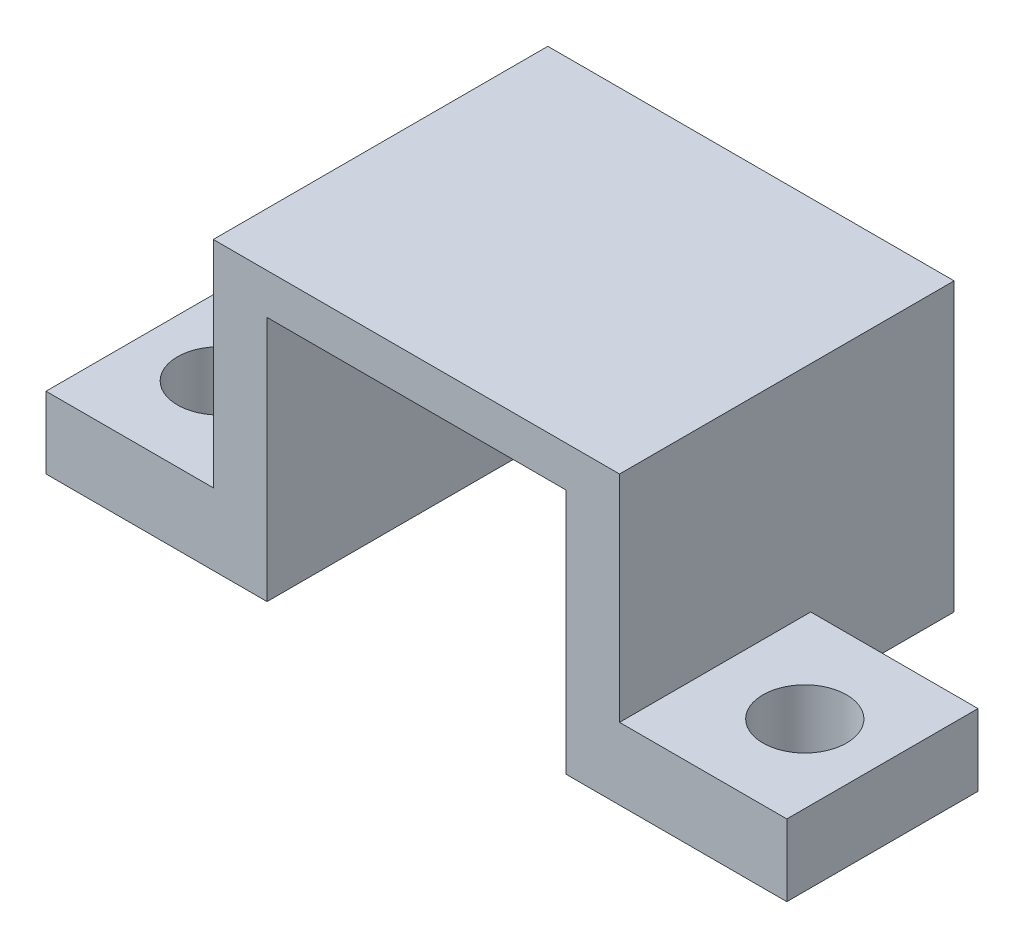
ISO-10303-21;
HEADER;
FILE_DESCRIPTION(('STEP AP214'),'2;1');
FILE_NAME('part.step','',(''),(''),'','','');
FILE_SCHEMA(('AUTOMOTIVE_DESIGN { 1 0 10303 214 1 1 1 1 }'));
ENDSEC;
DATA;
#1=APPLICATION_CONTEXT('core data for automotive mechanical design processes');
#2=APPLICATION_PROTOCOL_DEFINITION('international standard','automotive_design',2000,#1);
#3=PRODUCT_CONTEXT('',#1,'mechanical');
#4=PRODUCT('Part','Part','',(#3));
#5=PRODUCT_RELATED_PRODUCT_CATEGORY('part','',(#4));
#6=PRODUCT_DEFINITION_FORMATION('','',#4);
#7=PRODUCT_DEFINITION_CONTEXT('part definition',#1,'design');
#8=PRODUCT_DEFINITION('design','',#6,#7);
#9=PRODUCT_DEFINITION_SHAPE('','',#8);
#10=(LENGTH_UNIT() NAMED_UNIT(*) SI_UNIT(.MILLI.,.METRE.));
#11=(NAMED_UNIT(*) PLANE_ANGLE_UNIT() SI_UNIT($,.RADIAN.));
#12=(NAMED_UNIT(*) SI_UNIT($,.STERADIAN.) SOLID_ANGLE_UNIT());
#13=UNCERTAINTY_MEASURE_WITH_UNIT(LENGTH_MEASURE(1.E-05),#10,'distance_accuracy_value','');
#14=(GEOMETRIC_REPRESENTATION_CONTEXT(3) GLOBAL_UNCERTAINTY_ASSIGNED_CONTEXT((#13)) GLOBAL_UNIT_ASSIGNED_CONTEXT((#10,
#11,#12)) REPRESENTATION_CONTEXT('',''));
#15=CARTESIAN_POINT('',(0.,0.,0.));
#16=DIRECTION('',(0.,0.,1.));
#17=DIRECTION('',(1.,0.,0.));
#18=AXIS2_PLACEMENT_3D('',#15,#16,#17);
#19=CARTESIAN_POINT('',(0.,5.00000041370185E-05,0.));
#20=DIRECTION('',(0.,-1.,0.));
#21=DIRECTION('',(0.,0.,-1.));
#22=AXIS2_PLACEMENT_3D('',#19,#20,#21);
#23=PLANE('',#22);
#24=CARTESIAN_POINT('',(3.25002521276474,5.00000041370185E-05,10.0000251680613));
#25=DIRECTION('',(0.,-1.,0.));
#26=DIRECTION('',(0.,0.,-1.));
#27=AXIS2_PLACEMENT_3D('',#24,#25,#26);
#28=CIRCLE('',#27,1.75);
#29=CARTESIAN_POINT('',(3.25002521276474,5.00000041370185E-05,8.25002516806126));
#30=VERTEX_POINT('',#29);
#31=EDGE_CURVE('E170',#30,#30,#28,.T.);
#32=ORIENTED_EDGE('',*,*,#31,.F.);
#33=EDGE_LOOP('',(#32));
#34=FACE_BOUND('',#33,.T.);
#35=DIRECTION('',(0.,0.,1.));
#36=VECTOR('',#35,1.);
#37=CARTESIAN_POINT('',(9.25002433359623,5.00000041370185E-05,2.46800482273102E-05));
#38=LINE('',#37,#36);
#39=CARTESIAN_POINT('',(9.25002433359623,5.00000041370185E-05,2.46800482273102E-05));
#40=VERTEX_POINT('',#39);
#41=CARTESIAN_POINT('',(9.25002433359623,5.00000041370185E-05,14.0000246465206));
#42=VERTEX_POINT('',#41);
#43=EDGE_CURVE('E231',#40,#42,#38,.T.);
#44=ORIENTED_EDGE('',*,*,#43,.T.);
#45=DIRECTION('',(-1.,0.,0.));
#46=VECTOR('',#45,1.);
#47=CARTESIAN_POINT('',(24.0000262856483,5.00000041370185E-05,14.0000246465206));
#48=LINE('',#47,#46);
#49=CARTESIAN_POINT('',(2.51457095146179E-05,5.00000041369643E-05,14.0000246465206));
#50=VERTEX_POINT('',#49);
#51=EDGE_CURVE('E278',#42,#50,#48,.T.);
#52=ORIENTED_EDGE('',*,*,#51,.T.);
#53=DIRECTION('',(0.,0.,1.));
#54=VECTOR('',#53,1.);
#55=CARTESIAN_POINT('',(2.51457095146179E-05,5.00000041369643E-05,14.0000246465206));
#56=LINE('',#55,#54);
#57=CARTESIAN_POINT('',(2.51457095154853E-05,5.00000041368017E-05,6.00002473220229));
#58=VERTEX_POINT('',#57);
#59=EDGE_CURVE('E191',#58,#50,#56,.T.);
#60=ORIENTED_EDGE('',*,*,#59,.F.);
#61=DIRECTION('',(1.,0.,0.));
#62=VECTOR('',#61,1.);
#63=CARTESIAN_POINT('',(2.51457095154853E-05,5.00000041368017E-05,6.00002473220229));
#64=LINE('',#63,#62);
#65=CARTESIAN_POINT('',(7.00002443045378,5.00000041368017E-05,6.00002473220229));
#66=VERTEX_POINT('',#65);
#67=EDGE_CURVE('E209',#58,#66,#64,.T.);
#68=ORIENTED_EDGE('',*,*,#67,.T.);
#69=DIRECTION('',(0.,0.,-1.));
#70=VECTOR('',#69,1.);
#71=CARTESIAN_POINT('',(7.00002443045378,5.00000041370185E-05,14.0000246465206));
#72=LINE('',#71,#70);
#73=CARTESIAN_POINT('',(7.00002443045378,5.00000041370185E-05,2.46800482273102E-05));
#74=VERTEX_POINT('',#73);
#75=EDGE_CURVE('E259',#66,#74,#72,.T.);
#76=ORIENTED_EDGE('',*,*,#75,.T.);
#77=DIRECTION('',(1.,0.,0.));
#78=VECTOR('',#77,1.);
#79=CARTESIAN_POINT('',(7.00002443045378,5.00000041370185E-05,2.46800482273102E-05));
#80=LINE('',#79,#78);
#81=EDGE_CURVE('E271',#74,#40,#80,.T.);
#82=ORIENTED_EDGE('',*,*,#81,.T.);
#83=EDGE_LOOP('',(#44,#52,#60,#68,#76,#82));
#84=FACE_BOUND('',#83,.T.);
#85=ADVANCED_FACE('F39',(#34,#84),#23,.T.);
#86=CARTESIAN_POINT('',(7.00002443045378,12.0000503957272,2.46800482273102E-05));
#87=DIRECTION('',(0.,0.,-1.));
#88=DIRECTION('',(-1.,0.,0.));
#89=AXIS2_PLACEMENT_3D('',#86,#87,#88);
#90=PLANE('',#89);
#91=DIRECTION('',(0.,-1.,0.));
#92=VECTOR('',#91,1.);
#93=CARTESIAN_POINT('',(9.25002433359623,10.3000504896045,2.46800482273102E-05));
#94=LINE('',#93,#92);
#95=CARTESIAN_POINT('',(9.25002433359623,10.3000504896045,2.46800482273102E-05));
#96=VERTEX_POINT('',#95);
#97=EDGE_CURVE('E218',#96,#40,#94,.T.);
#98=ORIENTED_EDGE('',*,*,#97,.T.);
#99=ORIENTED_EDGE('',*,*,#81,.F.);
#100=DIRECTION('',(0.,-1.,0.));
#101=VECTOR('',#100,1.);
#102=CARTESIAN_POINT('',(7.00002443045378,12.0000503957272,2.46800482273102E-05));
#103=LINE('',#102,#101);
#104=CARTESIAN_POINT('',(7.00002443045378,12.0000503957272,2.46800482273102E-05));
#105=VERTEX_POINT('',#104);
#106=EDGE_CURVE('E11',#105,#74,#103,.T.);
#107=ORIENTED_EDGE('',*,*,#106,.F.);
#108=DIRECTION('',(1.,0.,0.));
#109=VECTOR('',#108,1.);
#110=CARTESIAN_POINT('',(7.00002443045378,12.0000503957272,2.46800482273102E-05));
#111=LINE('',#110,#109);
#112=CARTESIAN_POINT('',(24.0000262856483,12.0000503957272,2.46800482273102E-05));
#113=VERTEX_POINT('',#112);
#114=EDGE_CURVE('E254',#105,#113,#111,.T.);
#115=ORIENTED_EDGE('',*,*,#114,.T.);
#116=DIRECTION('',(0.,-1.,0.));
#117=VECTOR('',#116,1.);
#118=CARTESIAN_POINT('',(24.0000262856483,12.0000503957272,2.46800482273102E-05));
#119=LINE('',#118,#117);
#120=CARTESIAN_POINT('',(24.0000262856483,5.00000041370185E-05,2.46800482273102E-05));
#121=VERTEX_POINT('',#120);
#122=EDGE_CURVE('E270',#113,#121,#119,.T.);
#123=ORIENTED_EDGE('',*,*,#122,.T.);
#124=CARTESIAN_POINT('',(21.7500254511833,5.00000041370185E-05,2.46800482273102E-05));
#125=VERTEX_POINT('',#124);
#126=EDGE_CURVE('E244',#125,#121,#80,.T.);
#127=ORIENTED_EDGE('',*,*,#126,.F.);
#128=DIRECTION('',(0.,1.,0.));
#129=VECTOR('',#128,1.);
#130=CARTESIAN_POINT('',(21.7500254511833,5.00000041369914E-05,2.46800482273102E-05));
#131=LINE('',#130,#129);
#132=CARTESIAN_POINT('',(21.7500254511833,10.3000504896045,2.46800482273102E-05));
#133=VERTEX_POINT('',#132);
#134=EDGE_CURVE('E222',#125,#133,#131,.T.);
#135=ORIENTED_EDGE('',*,*,#134,.T.);
#136=DIRECTION('',(-1.,0.,0.));
#137=VECTOR('',#136,1.);
#138=CARTESIAN_POINT('',(21.7500254511833,10.3000504896045,2.46800482273102E-05));
#139=LINE('',#138,#137);
#140=EDGE_CURVE('E227',#133,#96,#139,.T.);
#141=ORIENTED_EDGE('',*,*,#140,.T.);
#142=EDGE_LOOP('',(#98,#99,#107,#115,#123,#127,#135,#141));
#143=FACE_BOUND('',#142,.T.);
#144=ADVANCED_FACE('F41',(#143),#90,.T.);
#145=CARTESIAN_POINT('',(7.00002443045378,12.0000503957272,14.0000246465206));
#146=DIRECTION('',(-1.,0.,0.));
#147=DIRECTION('',(0.,0.,1.));
#148=AXIS2_PLACEMENT_3D('',#145,#146,#147);
#149=PLANE('',#148);
#150=DIRECTION('',(0.,0.,-1.));
#151=VECTOR('',#150,1.);
#152=CARTESIAN_POINT('',(7.00002443045378,3.00005008466542,6.00002473220229));
#153=LINE('',#152,#151);
#154=CARTESIAN_POINT('',(7.00002443045378,3.00005008466542,14.0000246465206));
#155=VERTEX_POINT('',#154);
#156=CARTESIAN_POINT('',(7.00002443045378,3.00005008466542,6.00002473220229));
#157=VERTEX_POINT('',#156);
#158=EDGE_CURVE('E199',#155,#157,#153,.T.);
#159=ORIENTED_EDGE('',*,*,#158,.F.);
#160=DIRECTION('',(0.,-1.,0.));
#161=VECTOR('',#160,1.);
#162=CARTESIAN_POINT('',(7.00002443045378,12.0000503957272,14.0000246465206));
#163=LINE('',#162,#161);
#164=CARTESIAN_POINT('',(7.00002443045378,12.0000503957272,14.0000246465206));
#165=VERTEX_POINT('',#164);
#166=EDGE_CURVE('E49',#165,#155,#163,.T.);
#167=ORIENTED_EDGE('',*,*,#166,.F.);
#168=DIRECTION('',(0.,0.,-1.));
#169=VECTOR('',#168,1.);
#170=CARTESIAN_POINT('',(7.00002443045378,12.0000503957272,14.0000246465206));
#171=LINE('',#170,#169);
#172=EDGE_CURVE('E266',#165,#105,#171,.T.);
#173=ORIENTED_EDGE('',*,*,#172,.T.);
#174=ORIENTED_EDGE('',*,*,#106,.T.);
#175=ORIENTED_EDGE('',*,*,#75,.F.);
#176=DIRECTION('',(0.,-1.,0.));
#177=VECTOR('',#176,1.);
#178=CARTESIAN_POINT('',(7.00002443045378,5.00000041368017E-05,6.00002473220229));
#179=LINE('',#178,#177);
#180=EDGE_CURVE('E188',#157,#66,#179,.T.);
#181=ORIENTED_EDGE('',*,*,#180,.F.);
#182=EDGE_LOOP('',(#159,#167,#173,#174,#175,#181));
#183=FACE_BOUND('',#182,.T.);
#184=ADVANCED_FACE('F319',(#183),#149,.T.);
#185=CARTESIAN_POINT('',(24.0000262856483,12.0000503957272,14.0000246465206));
#186=DIRECTION('',(0.,0.,1.));
#187=DIRECTION('',(1.,0.,0.));
#188=AXIS2_PLACEMENT_3D('',#185,#186,#187);
#189=PLANE('',#188);
#190=DIRECTION('',(0.,-1.,0.));
#191=VECTOR('',#190,1.);
#192=CARTESIAN_POINT('',(9.25002433359623,10.3000504896045,14.0000246465206));
#193=LINE('',#192,#191);
#194=CARTESIAN_POINT('',(9.25002433359623,10.3000504896045,14.0000246465206));
#195=VERTEX_POINT('',#194);
#196=EDGE_CURVE('E217',#195,#42,#193,.T.);
#197=ORIENTED_EDGE('',*,*,#196,.F.);
#198=DIRECTION('',(-1.,0.,0.));
#199=VECTOR('',#198,1.);
#200=CARTESIAN_POINT('',(21.7500254511833,10.3000504896045,14.0000246465206));
#201=LINE('',#200,#199);
#202=CARTESIAN_POINT('',(21.7500254511833,10.3000504896045,14.0000246465206));
#203=VERTEX_POINT('',#202);
#204=EDGE_CURVE('E223',#203,#195,#201,.T.);
#205=ORIENTED_EDGE('',*,*,#204,.F.);
#206=DIRECTION('',(0.,1.,0.));
#207=VECTOR('',#206,1.);
#208=CARTESIAN_POINT('',(21.7500254511833,5.00000041369914E-05,14.0000246465206));
#209=LINE('',#208,#207);
#210=CARTESIAN_POINT('',(21.7500254511833,5.00000041369914E-05,14.0000246465206));
#211=VERTEX_POINT('',#210);
#212=EDGE_CURVE('E234',#211,#203,#209,.T.);
#213=ORIENTED_EDGE('',*,*,#212,.F.);
#214=CARTESIAN_POINT('',(31.0000255703926,5.00000041370185E-05,14.0000246465206));
#215=VERTEX_POINT('',#214);
#216=EDGE_CURVE('E151',#215,#211,#48,.T.);
#217=ORIENTED_EDGE('',*,*,#216,.F.);
#218=DIRECTION('',(0.,-1.,0.));
#219=VECTOR('',#218,1.);
#220=CARTESIAN_POINT('',(31.0000255703926,5.00000041370185E-05,14.0000246465206));
#221=LINE('',#220,#219);
#222=CARTESIAN_POINT('',(31.0000255703926,3.00005008466542,14.0000246465206));
#223=VERTEX_POINT('',#222);
#224=EDGE_CURVE('E142',#223,#215,#221,.T.);
#225=ORIENTED_EDGE('',*,*,#224,.F.);
#226=DIRECTION('',(-1.,0.,0.));
#227=VECTOR('',#226,1.);
#228=CARTESIAN_POINT('',(31.0000255703926,3.00005008466542,14.0000246465206));
#229=LINE('',#228,#227);
#230=CARTESIAN_POINT('',(24.0000262856483,3.00005008466542,14.0000246465206));
#231=VERTEX_POINT('',#230);
#232=EDGE_CURVE('E147',#223,#231,#229,.T.);
#233=ORIENTED_EDGE('',*,*,#232,.T.);
#234=DIRECTION('',(0.,-1.,0.));
#235=VECTOR('',#234,1.);
#236=CARTESIAN_POINT('',(24.0000262856483,12.0000503957272,14.0000246465206));
#237=LINE('',#236,#235);
#238=CARTESIAN_POINT('',(24.0000262856483,12.0000503957272,14.0000246465206));
#239=VERTEX_POINT('',#238);
#240=EDGE_CURVE('E57',#239,#231,#237,.T.);
#241=ORIENTED_EDGE('',*,*,#240,.F.);
#242=DIRECTION('',(-1.,0.,0.));
#243=VECTOR('',#242,1.);
#244=CARTESIAN_POINT('',(24.0000262856483,12.0000503957272,14.0000246465206));
#245=LINE('',#244,#243);
#246=EDGE_CURVE('E262',#239,#165,#245,.T.);
#247=ORIENTED_EDGE('',*,*,#246,.T.);
#248=ORIENTED_EDGE('',*,*,#166,.T.);
#249=DIRECTION('',(1.,0.,0.));
#250=VECTOR('',#249,1.);
#251=CARTESIAN_POINT('',(2.51457095146179E-05,3.00005008466542,14.0000246465206));
#252=LINE('',#251,#250);
#253=CARTESIAN_POINT('',(2.51457095146179E-05,3.00005008466542,14.0000246465206));
#254=VERTEX_POINT('',#253);
#255=EDGE_CURVE('E198',#254,#155,#252,.T.);
#256=ORIENTED_EDGE('',*,*,#255,.F.);
#257=DIRECTION('',(0.,1.,0.));
#258=VECTOR('',#257,1.);
#259=CARTESIAN_POINT('',(2.51457095146179E-05,3.00005008466542,14.0000246465206));
#260=LINE('',#259,#258);
#261=EDGE_CURVE('E195',#50,#254,#260,.T.);
#262=ORIENTED_EDGE('',*,*,#261,.F.);
#263=ORIENTED_EDGE('',*,*,#51,.F.);
#264=EDGE_LOOP('',(#197,#205,#213,#217,#225,#233,#241,#247,#248,#256,#262,#263));
#265=FACE_BOUND('',#264,.T.);
#266=ADVANCED_FACE('F145',(#265),#189,.T.);
#267=CARTESIAN_POINT('',(24.0000262856483,12.0000503957272,2.46800482273102E-05));
#268=DIRECTION('',(1.,0.,0.));
#269=DIRECTION('',(0.,0.,-1.));
#270=AXIS2_PLACEMENT_3D('',#267,#268,#269);
#271=PLANE('',#270);
#272=DIRECTION('',(0.,0.,1.));
#273=VECTOR('',#272,1.);
#274=CARTESIAN_POINT('',(24.0000262856483,3.00005008466542,14.0000246465206));
#275=LINE('',#274,#273);
#276=CARTESIAN_POINT('',(24.0000262856483,3.00005008466542,6.00002473220229));
#277=VERTEX_POINT('',#276);
#278=EDGE_CURVE('E168',#277,#231,#275,.T.);
#279=ORIENTED_EDGE('',*,*,#278,.F.);
#280=DIRECTION('',(0.,1.,0.));
#281=VECTOR('',#280,1.);
#282=CARTESIAN_POINT('',(24.0000262856483,3.00005008466542,6.00002473220229));
#283=LINE('',#282,#281);
#284=CARTESIAN_POINT('',(24.0000262856483,5.00000041370185E-05,6.00002473220229));
#285=VERTEX_POINT('',#284);
#286=EDGE_CURVE('E63',#285,#277,#283,.T.);
#287=ORIENTED_EDGE('',*,*,#286,.F.);
#288=DIRECTION('',(0.,0.,1.));
#289=VECTOR('',#288,1.);
#290=CARTESIAN_POINT('',(24.0000262856483,5.00000041370185E-05,2.46800482273102E-05));
#291=LINE('',#290,#289);
#292=EDGE_CURVE('E275',#121,#285,#291,.T.);
#293=ORIENTED_EDGE('',*,*,#292,.F.);
#294=ORIENTED_EDGE('',*,*,#122,.F.);
#295=DIRECTION('',(0.,0.,1.));
#296=VECTOR('',#295,1.);
#297=CARTESIAN_POINT('',(24.0000262856483,12.0000503957272,2.46800482273102E-05));
#298=LINE('',#297,#296);
#299=EDGE_CURVE('E258',#113,#239,#298,.T.);
#300=ORIENTED_EDGE('',*,*,#299,.T.);
#301=ORIENTED_EDGE('',*,*,#240,.T.);
#302=EDGE_LOOP('',(#279,#287,#293,#294,#300,#301));
#303=FACE_BOUND('',#302,.T.);
#304=ADVANCED_FACE('F336',(#303),#271,.T.);
#305=CARTESIAN_POINT('',(0.,12.0000503957272,0.));
#306=DIRECTION('',(0.,-1.,0.));
#307=DIRECTION('',(0.,0.,-1.));
#308=AXIS2_PLACEMENT_3D('',#305,#306,#307);
#309=PLANE('',#308);
#310=ORIENTED_EDGE('',*,*,#114,.F.);
#311=ORIENTED_EDGE('',*,*,#172,.F.);
#312=ORIENTED_EDGE('',*,*,#246,.F.);
#313=ORIENTED_EDGE('',*,*,#299,.F.);
#314=EDGE_LOOP('',(#310,#311,#312,#313));
#315=FACE_BOUND('',#314,.T.);
#316=ADVANCED_FACE('F327',(#315),#309,.F.);
#317=CARTESIAN_POINT('',(27.7513756752014,5.00000041370185E-05,10.0000251680613));
#318=DIRECTION('',(0.,-1.,0.));
#319=DIRECTION('',(0.,0.,-1.));
#320=AXIS2_PLACEMENT_3D('',#317,#318,#319);
#321=CIRCLE('',#320,1.75);
#322=CARTESIAN_POINT('',(27.7513756752014,5.00000041370185E-05,8.25002516806126));
#323=VERTEX_POINT('',#322);
#324=EDGE_CURVE('E341',#323,#323,#321,.T.);
#325=ORIENTED_EDGE('',*,*,#324,.F.);
#326=EDGE_LOOP('',(#325));
#327=FACE_BOUND('',#326,.T.);
#328=DIRECTION('',(0.,0.,1.));
#329=VECTOR('',#328,1.);
#330=CARTESIAN_POINT('',(21.7500254511833,5.00000041369914E-05,2.46800482273102E-05));
#331=LINE('',#330,#329);
#332=EDGE_CURVE('E248',#125,#211,#331,.T.);
#333=ORIENTED_EDGE('',*,*,#332,.F.);
#334=ORIENTED_EDGE('',*,*,#126,.T.);
#335=ORIENTED_EDGE('',*,*,#292,.T.);
#336=DIRECTION('',(-1.,0.,0.));
#337=VECTOR('',#336,1.);
#338=CARTESIAN_POINT('',(31.0000255703926,5.00000041369643E-05,6.00002473220229));
#339=LINE('',#338,#337);
#340=CARTESIAN_POINT('',(31.0000255703926,5.00000041369643E-05,6.00002473220229));
#341=VERTEX_POINT('',#340);
#342=EDGE_CURVE('E171',#341,#285,#339,.T.);
#343=ORIENTED_EDGE('',*,*,#342,.F.);
#344=DIRECTION('',(0.,0.,-1.));
#345=VECTOR('',#344,1.);
#346=CARTESIAN_POINT('',(31.0000255703926,5.00000041369643E-05,6.00002473220229));
#347=LINE('',#346,#345);
#348=EDGE_CURVE('E155',#215,#341,#347,.T.);
#349=ORIENTED_EDGE('',*,*,#348,.F.);
#350=ORIENTED_EDGE('',*,*,#216,.T.);
#351=EDGE_LOOP('',(#333,#334,#335,#343,#349,#350));
#352=FACE_BOUND('',#351,.T.);
#353=ADVANCED_FACE('F315',(#327,#352),#23,.T.);
#354=CARTESIAN_POINT('',(9.25002433359623,10.3000504896045,2.46800482273102E-05));
#355=DIRECTION('',(-1.,0.,0.));
#356=DIRECTION('',(0.,0.,1.));
#357=AXIS2_PLACEMENT_3D('',#354,#355,#356);
#358=PLANE('',#357);
#359=ORIENTED_EDGE('',*,*,#196,.T.);
#360=ORIENTED_EDGE('',*,*,#43,.F.);
#361=ORIENTED_EDGE('',*,*,#97,.F.);
#362=DIRECTION('',(0.,0.,1.));
#363=VECTOR('',#362,1.);
#364=CARTESIAN_POINT('',(9.25002433359623,10.3000504896045,2.46800482273102E-05));
#365=LINE('',#364,#363);
#366=EDGE_CURVE('E241',#96,#195,#365,.T.);
#367=ORIENTED_EDGE('',*,*,#366,.T.);
#368=EDGE_LOOP('',(#359,#360,#361,#367));
#369=FACE_BOUND('',#368,.T.);
#370=ADVANCED_FACE('F326',(#369),#358,.F.);
#371=CARTESIAN_POINT('',(21.7500254511833,10.3000504896045,2.46800482273102E-05));
#372=DIRECTION('',(0.,1.,0.));
#373=DIRECTION('',(0.,0.,1.));
#374=AXIS2_PLACEMENT_3D('',#371,#372,#373);
#375=PLANE('',#374);
#376=ORIENTED_EDGE('',*,*,#204,.T.);
#377=ORIENTED_EDGE('',*,*,#366,.F.);
#378=ORIENTED_EDGE('',*,*,#140,.F.);
#379=DIRECTION('',(0.,0.,1.));
#380=VECTOR('',#379,1.);
#381=CARTESIAN_POINT('',(21.7500254511833,10.3000504896045,2.46800482273102E-05));
#382=LINE('',#381,#380);
#383=EDGE_CURVE('E245',#133,#203,#382,.T.);
#384=ORIENTED_EDGE('',*,*,#383,.T.);
#385=EDGE_LOOP('',(#376,#377,#378,#384));
#386=FACE_BOUND('',#385,.T.);
#387=ADVANCED_FACE('F333',(#386),#375,.F.);
#388=CARTESIAN_POINT('',(21.7500254511833,5.00000041369914E-05,2.46800482273102E-05));
#389=DIRECTION('',(1.,0.,0.));
#390=DIRECTION('',(0.,0.,-1.));
#391=AXIS2_PLACEMENT_3D('',#388,#389,#390);
#392=PLANE('',#391);
#393=ORIENTED_EDGE('',*,*,#212,.T.);
#394=ORIENTED_EDGE('',*,*,#383,.F.);
#395=ORIENTED_EDGE('',*,*,#134,.F.);
#396=ORIENTED_EDGE('',*,*,#332,.T.);
#397=EDGE_LOOP('',(#393,#394,#395,#396));
#398=FACE_BOUND('',#397,.T.);
#399=ADVANCED_FACE('F363',(#398),#392,.F.);
#400=CARTESIAN_POINT('',(2.51457095154853E-05,3.00005008466542,6.00002473220229));
#401=DIRECTION('',(0.,-1.,0.));
#402=DIRECTION('',(0.,0.,-1.));
#403=AXIS2_PLACEMENT_3D('',#400,#401,#402);
#404=PLANE('',#403);
#405=CARTESIAN_POINT('',(3.25002521276474,3.00005008466542,10.0000251680613));
#406=DIRECTION('',(0.,-1.,0.));
#407=DIRECTION('',(0.,0.,-1.));
#408=AXIS2_PLACEMENT_3D('',#405,#406,#407);
#409=CIRCLE('',#408,1.75);
#410=CARTESIAN_POINT('',(3.25002521276474,3.00005008466542,8.25002516806126));
#411=VERTEX_POINT('',#410);
#412=EDGE_CURVE('E176',#411,#411,#409,.T.);
#413=ORIENTED_EDGE('',*,*,#412,.T.);
#414=EDGE_LOOP('',(#413));
#415=FACE_BOUND('',#414,.T.);
#416=ORIENTED_EDGE('',*,*,#158,.T.);
#417=DIRECTION('',(1.,0.,0.));
#418=VECTOR('',#417,1.);
#419=CARTESIAN_POINT('',(2.51457095154853E-05,3.00005008466542,6.00002473220229));
#420=LINE('',#419,#418);
#421=CARTESIAN_POINT('',(2.51457095154853E-05,3.00005008466542,6.00002473220229));
#422=VERTEX_POINT('',#421);
#423=EDGE_CURVE('E213',#422,#157,#420,.T.);
#424=ORIENTED_EDGE('',*,*,#423,.F.);
#425=DIRECTION('',(0.,0.,-1.));
#426=VECTOR('',#425,1.);
#427=CARTESIAN_POINT('',(2.51457095154853E-05,3.00005008466542,6.00002473220229));
#428=LINE('',#427,#426);
#429=EDGE_CURVE('E183',#254,#422,#428,.T.);
#430=ORIENTED_EDGE('',*,*,#429,.F.);
#431=ORIENTED_EDGE('',*,*,#255,.T.);
#432=EDGE_LOOP('',(#416,#424,#430,#431));
#433=FACE_BOUND('',#432,.T.);
#434=ADVANCED_FACE('F294',(#415,#433),#404,.F.);
#435=CARTESIAN_POINT('',(2.51457095154853E-05,5.00000041368017E-05,6.00002473220229));
#436=DIRECTION('',(0.,0.,1.));
#437=DIRECTION('',(1.,0.,0.));
#438=AXIS2_PLACEMENT_3D('',#435,#436,#437);
#439=PLANE('',#438);
#440=ORIENTED_EDGE('',*,*,#180,.T.);
#441=ORIENTED_EDGE('',*,*,#67,.F.);
#442=DIRECTION('',(0.,-1.,0.));
#443=VECTOR('',#442,1.);
#444=CARTESIAN_POINT('',(2.51457095154853E-05,5.00000041368017E-05,6.00002473220229));
#445=LINE('',#444,#443);
#446=EDGE_CURVE('E187',#422,#58,#445,.T.);
#447=ORIENTED_EDGE('',*,*,#446,.F.);
#448=ORIENTED_EDGE('',*,*,#423,.T.);
#449=EDGE_LOOP('',(#440,#441,#447,#448));
#450=FACE_BOUND('',#449,.T.);
#451=ADVANCED_FACE('F309',(#450),#439,.F.);
#452=CARTESIAN_POINT('',(2.51457095163526E-05,0.,0.));
#453=DIRECTION('',(1.,0.,0.));
#454=DIRECTION('',(0.,0.,-1.));
#455=AXIS2_PLACEMENT_3D('',#452,#453,#454);
#456=PLANE('',#455);
#457=ORIENTED_EDGE('',*,*,#429,.T.);
#458=ORIENTED_EDGE('',*,*,#446,.T.);
#459=ORIENTED_EDGE('',*,*,#59,.T.);
#460=ORIENTED_EDGE('',*,*,#261,.T.);
#461=EDGE_LOOP('',(#457,#458,#459,#460));
#462=FACE_BOUND('',#461,.T.);
#463=ADVANCED_FACE('F299',(#462),#456,.F.);
#464=CARTESIAN_POINT('',(3.25002521276474,12.0000503957272,10.0000251680613));
#465=DIRECTION('',(0.,-1.,0.));
#466=DIRECTION('',(0.,0.,-1.));
#467=AXIS2_PLACEMENT_3D('',#464,#465,#466);
#468=CYLINDRICAL_SURFACE('',#467,1.75);
#469=ORIENTED_EDGE('',*,*,#31,.T.);
#470=EDGE_LOOP('',(#469));
#471=FACE_BOUND('',#470,.T.);
#472=ORIENTED_EDGE('',*,*,#412,.F.);
#473=EDGE_LOOP('',(#472));
#474=FACE_BOUND('',#473,.T.);
#475=ADVANCED_FACE('F297',(#471,#474),#468,.F.);
#476=CARTESIAN_POINT('',(31.0000255703926,3.00005008466542,14.0000246465206));
#477=DIRECTION('',(0.,-1.,0.));
#478=DIRECTION('',(0.,0.,-1.));
#479=AXIS2_PLACEMENT_3D('',#476,#477,#478);
#480=PLANE('',#479);
#481=CARTESIAN_POINT('',(27.7513756752014,3.00005008466542,10.0000251680613));
#482=DIRECTION('',(0.,-1.,0.));
#483=DIRECTION('',(0.,0.,-1.));
#484=AXIS2_PLACEMENT_3D('',#481,#482,#483);
#485=CIRCLE('',#484,1.75);
#486=CARTESIAN_POINT('',(27.7513756752014,3.00005008466542,8.25002516806126));
#487=VERTEX_POINT('',#486);
#488=EDGE_CURVE('E43',#487,#487,#485,.T.);
#489=ORIENTED_EDGE('',*,*,#488,.T.);
#490=EDGE_LOOP('',(#489));
#491=FACE_BOUND('',#490,.T.);
#492=ORIENTED_EDGE('',*,*,#278,.T.);
#493=ORIENTED_EDGE('',*,*,#232,.F.);
#494=DIRECTION('',(0.,0.,1.));
#495=VECTOR('',#494,1.);
#496=CARTESIAN_POINT('',(31.0000255703926,3.00005008466542,14.0000246465206));
#497=LINE('',#496,#495);
#498=CARTESIAN_POINT('',(31.0000255703926,3.00005008466542,6.00002473220229));
#499=VERTEX_POINT('',#498);
#500=EDGE_CURVE('E156',#499,#223,#497,.T.);
#501=ORIENTED_EDGE('',*,*,#500,.F.);
#502=DIRECTION('',(-1.,0.,0.));
#503=VECTOR('',#502,1.);
#504=CARTESIAN_POINT('',(31.0000255703926,3.00005008466542,6.00002473220229));
#505=LINE('',#504,#503);
#506=EDGE_CURVE('E179',#499,#277,#505,.T.);
#507=ORIENTED_EDGE('',*,*,#506,.T.);
#508=EDGE_LOOP('',(#492,#493,#501,#507));
#509=FACE_BOUND('',#508,.T.);
#510=ADVANCED_FACE('F167',(#491,#509),#480,.F.);
#511=CARTESIAN_POINT('',(31.0000255703926,3.00005008466542,6.00002473220229));
#512=DIRECTION('',(0.,0.,1.));
#513=DIRECTION('',(1.,0.,0.));
#514=AXIS2_PLACEMENT_3D('',#511,#512,#513);
#515=PLANE('',#514);
#516=ORIENTED_EDGE('',*,*,#286,.T.);
#517=ORIENTED_EDGE('',*,*,#506,.F.);
#518=DIRECTION('',(0.,1.,0.));
#519=VECTOR('',#518,1.);
#520=CARTESIAN_POINT('',(31.0000255703926,3.00005008466542,6.00002473220229));
#521=LINE('',#520,#519);
#522=EDGE_CURVE('E161',#341,#499,#521,.T.);
#523=ORIENTED_EDGE('',*,*,#522,.F.);
#524=ORIENTED_EDGE('',*,*,#342,.T.);
#525=EDGE_LOOP('',(#516,#517,#523,#524));
#526=FACE_BOUND('',#525,.T.);
#527=ADVANCED_FACE('F306',(#526),#515,.F.);
#528=CARTESIAN_POINT('',(31.0000255703926,0.,0.));
#529=DIRECTION('',(-1.,0.,0.));
#530=DIRECTION('',(0.,0.,1.));
#531=AXIS2_PLACEMENT_3D('',#528,#529,#530);
#532=PLANE('',#531);
#533=ORIENTED_EDGE('',*,*,#500,.T.);
#534=ORIENTED_EDGE('',*,*,#224,.T.);
#535=ORIENTED_EDGE('',*,*,#348,.T.);
#536=ORIENTED_EDGE('',*,*,#522,.T.);
#537=EDGE_LOOP('',(#533,#534,#535,#536));
#538=FACE_BOUND('',#537,.T.);
#539=ADVANCED_FACE('F159',(#538),#532,.F.);
#540=CARTESIAN_POINT('',(27.7513756752014,12.0000503957272,10.0000251680613));
#541=DIRECTION('',(0.,-1.,0.));
#542=DIRECTION('',(0.,0.,-1.));
#543=AXIS2_PLACEMENT_3D('',#540,#541,#542);
#544=CYLINDRICAL_SURFACE('',#543,1.75);
#545=ORIENTED_EDGE('',*,*,#324,.T.);
#546=EDGE_LOOP('',(#545));
#547=FACE_BOUND('',#546,.T.);
#548=ORIENTED_EDGE('',*,*,#488,.F.);
#549=EDGE_LOOP('',(#548));
#550=FACE_BOUND('',#549,.T.);
#551=ADVANCED_FACE('F435',(#547,#550),#544,.F.);
#552=CLOSED_SHELL('',(#85,#144,#184,#266,#304,#316,#353,#370,#387,#399,#434,#451,#463,#475,#510,
#527,#539,#551));
#553=MANIFOLD_SOLID_BREP('B2',#552);
#554=ADVANCED_BREP_SHAPE_REPRESENTATION('',(#18,#553),#14);
#555=SHAPE_DEFINITION_REPRESENTATION(#9,#554);
ENDSEC;
END-ISO-10303-21;
